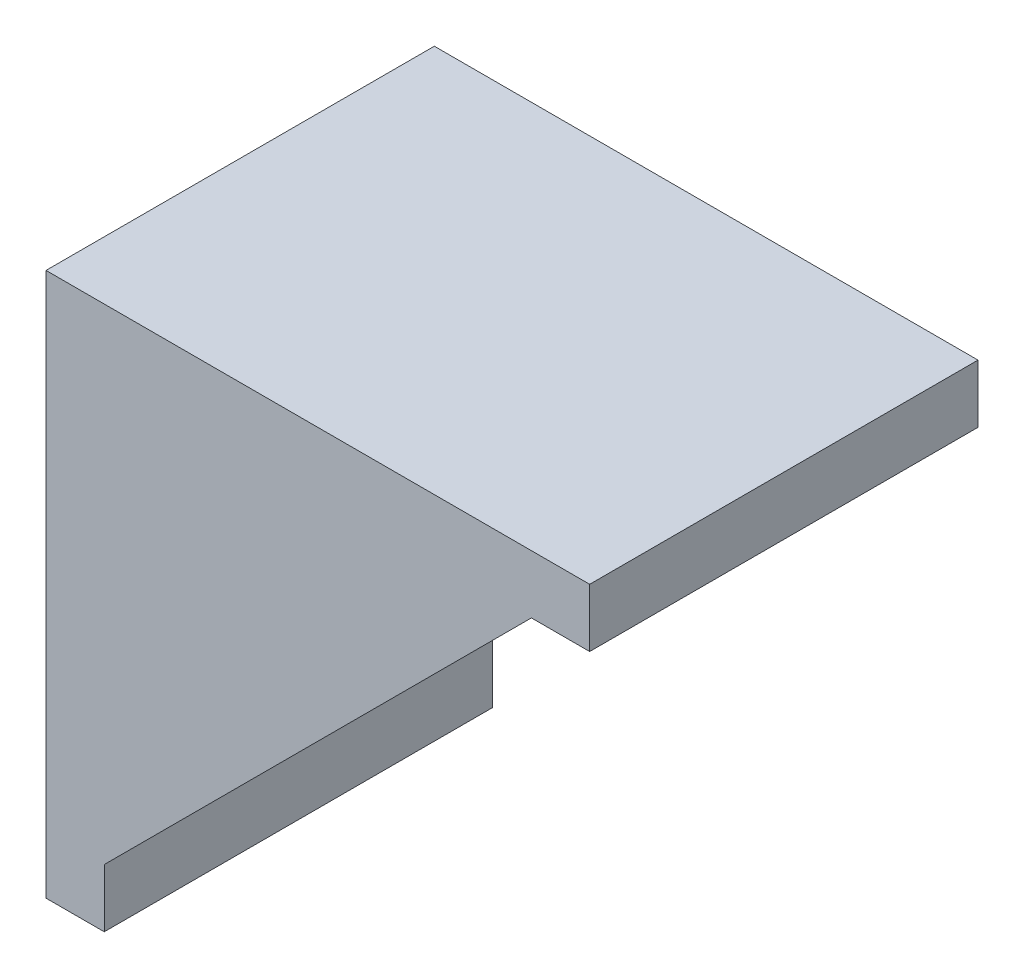
ISO-10303-21;
HEADER;
FILE_DESCRIPTION(('STEP AP214'),'2;1');
FILE_NAME('part.step','',(''),(''),'','','');
FILE_SCHEMA(('AUTOMOTIVE_DESIGN { 1 0 10303 214 1 1 1 1 }'));
ENDSEC;
DATA;
#1=APPLICATION_CONTEXT('core data for automotive mechanical design processes');
#2=APPLICATION_PROTOCOL_DEFINITION('international standard','automotive_design',2000,#1);
#3=PRODUCT_CONTEXT('',#1,'mechanical');
#4=PRODUCT('Part','Part','',(#3));
#5=PRODUCT_RELATED_PRODUCT_CATEGORY('part','',(#4));
#6=PRODUCT_DEFINITION_FORMATION('','',#4);
#7=PRODUCT_DEFINITION_CONTEXT('part definition',#1,'design');
#8=PRODUCT_DEFINITION('design','',#6,#7);
#9=PRODUCT_DEFINITION_SHAPE('','',#8);
#10=(LENGTH_UNIT() NAMED_UNIT(*) SI_UNIT(.MILLI.,.METRE.));
#11=(NAMED_UNIT(*) PLANE_ANGLE_UNIT() SI_UNIT($,.RADIAN.));
#12=(NAMED_UNIT(*) SI_UNIT($,.STERADIAN.) SOLID_ANGLE_UNIT());
#13=UNCERTAINTY_MEASURE_WITH_UNIT(LENGTH_MEASURE(1.E-05),#10,'distance_accuracy_value','');
#14=(GEOMETRIC_REPRESENTATION_CONTEXT(3) GLOBAL_UNCERTAINTY_ASSIGNED_CONTEXT((#13)) GLOBAL_UNIT_ASSIGNED_CONTEXT((#10,
#11,#12)) REPRESENTATION_CONTEXT('',''));
#15=CARTESIAN_POINT('',(0.,0.,0.));
#16=DIRECTION('',(0.,0.,1.));
#17=DIRECTION('',(1.,0.,0.));
#18=AXIS2_PLACEMENT_3D('',#15,#16,#17);
#19=CARTESIAN_POINT('',(-14.,14.,20.));
#20=DIRECTION('',(1.,0.,0.));
#21=DIRECTION('',(0.,1.,0.));
#22=AXIS2_PLACEMENT_3D('',#19,#20,#21);
#23=PLANE('',#22);
#24=DIRECTION('',(0.,-1.,0.));
#25=VECTOR('',#24,1.);
#26=CARTESIAN_POINT('',(-14.,14.,0.));
#27=LINE('',#26,#25);
#28=CARTESIAN_POINT('',(-14.,14.,0.));
#29=VERTEX_POINT('',#28);
#30=CARTESIAN_POINT('',(-14.,-14.,0.));
#31=VERTEX_POINT('',#30);
#32=EDGE_CURVE('E123',#29,#31,#27,.T.);
#33=ORIENTED_EDGE('',*,*,#32,.T.);
#34=DIRECTION('',(0.,0.,-1.));
#35=VECTOR('',#34,1.);
#36=CARTESIAN_POINT('',(-14.,-14.,20.));
#37=LINE('',#36,#35);
#38=CARTESIAN_POINT('',(-14.,-14.,20.));
#39=VERTEX_POINT('',#38);
#40=EDGE_CURVE('E11',#39,#31,#37,.T.);
#41=ORIENTED_EDGE('',*,*,#40,.F.);
#42=DIRECTION('',(0.,-1.,0.));
#43=VECTOR('',#42,1.);
#44=CARTESIAN_POINT('',(-14.,14.,20.));
#45=LINE('',#44,#43);
#46=CARTESIAN_POINT('',(-14.,14.,20.));
#47=VERTEX_POINT('',#46);
#48=EDGE_CURVE('E135',#47,#39,#45,.T.);
#49=ORIENTED_EDGE('',*,*,#48,.F.);
#50=DIRECTION('',(0.,0.,-1.));
#51=VECTOR('',#50,1.);
#52=CARTESIAN_POINT('',(-14.,14.,20.));
#53=LINE('',#52,#51);
#54=EDGE_CURVE('E119',#47,#29,#53,.T.);
#55=ORIENTED_EDGE('',*,*,#54,.T.);
#56=EDGE_LOOP('',(#33,#41,#49,#55));
#57=FACE_BOUND('',#56,.T.);
#58=ADVANCED_FACE('F33',(#57),#23,.F.);
#59=CARTESIAN_POINT('',(-14.,-14.,20.));
#60=DIRECTION('',(0.,1.,0.));
#61=DIRECTION('',(0.,0.,1.));
#62=AXIS2_PLACEMENT_3D('',#59,#60,#61);
#63=PLANE('',#62);
#64=DIRECTION('',(1.,0.,0.));
#65=VECTOR('',#64,1.);
#66=CARTESIAN_POINT('',(-14.,-14.,0.));
#67=LINE('',#66,#65);
#68=CARTESIAN_POINT('',(-11.,-14.,0.));
#69=VERTEX_POINT('',#68);
#70=EDGE_CURVE('E126',#31,#69,#67,.T.);
#71=ORIENTED_EDGE('',*,*,#70,.T.);
#72=DIRECTION('',(0.,0.,-1.));
#73=VECTOR('',#72,1.);
#74=CARTESIAN_POINT('',(-11.,-14.,20.));
#75=LINE('',#74,#73);
#76=CARTESIAN_POINT('',(-11.,-14.,20.));
#77=VERTEX_POINT('',#76);
#78=EDGE_CURVE('E41',#77,#69,#75,.T.);
#79=ORIENTED_EDGE('',*,*,#78,.F.);
#80=DIRECTION('',(1.,0.,0.));
#81=VECTOR('',#80,1.);
#82=CARTESIAN_POINT('',(-14.,-14.,20.));
#83=LINE('',#82,#81);
#84=EDGE_CURVE('E89',#39,#77,#83,.T.);
#85=ORIENTED_EDGE('',*,*,#84,.F.);
#86=ORIENTED_EDGE('',*,*,#40,.T.);
#87=EDGE_LOOP('',(#71,#79,#85,#86));
#88=FACE_BOUND('',#87,.T.);
#89=ADVANCED_FACE('F160',(#88),#63,.F.);
#90=CARTESIAN_POINT('',(-11.,-14.,20.));
#91=DIRECTION('',(-1.,0.,0.));
#92=DIRECTION('',(0.,0.,1.));
#93=AXIS2_PLACEMENT_3D('',#90,#91,#92);
#94=PLANE('',#93);
#95=DIRECTION('',(0.,1.,0.));
#96=VECTOR('',#95,1.);
#97=CARTESIAN_POINT('',(-11.,-14.,0.));
#98=LINE('',#97,#96);
#99=CARTESIAN_POINT('',(-11.,-11.,0.));
#100=VERTEX_POINT('',#99);
#101=EDGE_CURVE('E128',#69,#100,#98,.T.);
#102=ORIENTED_EDGE('',*,*,#101,.T.);
#103=DIRECTION('',(0.,0.,-1.));
#104=VECTOR('',#103,1.);
#105=CARTESIAN_POINT('',(-11.,-11.,20.));
#106=LINE('',#105,#104);
#107=CARTESIAN_POINT('',(-11.,-11.,20.));
#108=VERTEX_POINT('',#107);
#109=EDGE_CURVE('E139',#108,#100,#106,.T.);
#110=ORIENTED_EDGE('',*,*,#109,.F.);
#111=DIRECTION('',(0.,1.,0.));
#112=VECTOR('',#111,1.);
#113=CARTESIAN_POINT('',(-11.,-14.,20.));
#114=LINE('',#113,#112);
#115=EDGE_CURVE('E147',#77,#108,#114,.T.);
#116=ORIENTED_EDGE('',*,*,#115,.F.);
#117=ORIENTED_EDGE('',*,*,#78,.T.);
#118=EDGE_LOOP('',(#102,#110,#116,#117));
#119=FACE_BOUND('',#118,.T.);
#120=ADVANCED_FACE('F145',(#119),#94,.F.);
#121=CARTESIAN_POINT('',(-11.,-11.,20.));
#122=DIRECTION('',(-0.707106781186548,0.707106781186547,0.));
#123=DIRECTION('',(-0.707106781186547,-0.707106781186548,0.));
#124=AXIS2_PLACEMENT_3D('',#121,#122,#123);
#125=PLANE('',#124);
#126=DIRECTION('',(0.707106781186547,0.707106781186548,0.));
#127=VECTOR('',#126,1.);
#128=CARTESIAN_POINT('',(-11.,-11.,0.));
#129=LINE('',#128,#127);
#130=CARTESIAN_POINT('',(11.,11.,0.));
#131=VERTEX_POINT('',#130);
#132=EDGE_CURVE('E130',#100,#131,#129,.T.);
#133=ORIENTED_EDGE('',*,*,#132,.T.);
#134=DIRECTION('',(0.,0.,-1.));
#135=VECTOR('',#134,1.);
#136=CARTESIAN_POINT('',(11.,11.,20.));
#137=LINE('',#136,#135);
#138=CARTESIAN_POINT('',(11.,11.,20.));
#139=VERTEX_POINT('',#138);
#140=EDGE_CURVE('E114',#139,#131,#137,.T.);
#141=ORIENTED_EDGE('',*,*,#140,.F.);
#142=DIRECTION('',(0.707106781186547,0.707106781186548,0.));
#143=VECTOR('',#142,1.);
#144=CARTESIAN_POINT('',(-11.,-11.,20.));
#145=LINE('',#144,#143);
#146=EDGE_CURVE('E105',#108,#139,#145,.T.);
#147=ORIENTED_EDGE('',*,*,#146,.F.);
#148=ORIENTED_EDGE('',*,*,#109,.T.);
#149=EDGE_LOOP('',(#133,#141,#147,#148));
#150=FACE_BOUND('',#149,.T.);
#151=ADVANCED_FACE('F153',(#150),#125,.F.);
#152=CARTESIAN_POINT('',(14.,11.,20.));
#153=DIRECTION('',(0.,1.,0.));
#154=DIRECTION('',(0.,0.,1.));
#155=AXIS2_PLACEMENT_3D('',#152,#153,#154);
#156=PLANE('',#155);
#157=DIRECTION('',(1.,0.,0.));
#158=VECTOR('',#157,1.);
#159=CARTESIAN_POINT('',(14.,11.,0.));
#160=LINE('',#159,#158);
#161=CARTESIAN_POINT('',(14.,11.,0.));
#162=VERTEX_POINT('',#161);
#163=EDGE_CURVE('E113',#131,#162,#160,.T.);
#164=ORIENTED_EDGE('',*,*,#163,.T.);
#165=DIRECTION('',(0.,0.,-1.));
#166=VECTOR('',#165,1.);
#167=CARTESIAN_POINT('',(14.,11.,20.));
#168=LINE('',#167,#166);
#169=CARTESIAN_POINT('',(14.,11.,20.));
#170=VERTEX_POINT('',#169);
#171=EDGE_CURVE('E110',#170,#162,#168,.T.);
#172=ORIENTED_EDGE('',*,*,#171,.F.);
#173=DIRECTION('',(1.,0.,0.));
#174=VECTOR('',#173,1.);
#175=CARTESIAN_POINT('',(14.,11.,20.));
#176=LINE('',#175,#174);
#177=EDGE_CURVE('E99',#139,#170,#176,.T.);
#178=ORIENTED_EDGE('',*,*,#177,.F.);
#179=ORIENTED_EDGE('',*,*,#140,.T.);
#180=EDGE_LOOP('',(#164,#172,#178,#179));
#181=FACE_BOUND('',#180,.T.);
#182=ADVANCED_FACE('F111',(#181),#156,.F.);
#183=CARTESIAN_POINT('',(14.,14.,20.));
#184=DIRECTION('',(-1.,0.,0.));
#185=DIRECTION('',(0.,-1.,0.));
#186=AXIS2_PLACEMENT_3D('',#183,#184,#185);
#187=PLANE('',#186);
#188=DIRECTION('',(0.,1.,0.));
#189=VECTOR('',#188,1.);
#190=CARTESIAN_POINT('',(14.,14.,0.));
#191=LINE('',#190,#189);
#192=CARTESIAN_POINT('',(14.,14.,0.));
#193=VERTEX_POINT('',#192);
#194=EDGE_CURVE('E75',#162,#193,#191,.T.);
#195=ORIENTED_EDGE('',*,*,#194,.T.);
#196=DIRECTION('',(0.,0.,-1.));
#197=VECTOR('',#196,1.);
#198=CARTESIAN_POINT('',(14.,14.,20.));
#199=LINE('',#198,#197);
#200=CARTESIAN_POINT('',(14.,14.,20.));
#201=VERTEX_POINT('',#200);
#202=EDGE_CURVE('E115',#201,#193,#199,.T.);
#203=ORIENTED_EDGE('',*,*,#202,.F.);
#204=DIRECTION('',(0.,1.,0.));
#205=VECTOR('',#204,1.);
#206=CARTESIAN_POINT('',(14.,14.,20.));
#207=LINE('',#206,#205);
#208=EDGE_CURVE('E103',#170,#201,#207,.T.);
#209=ORIENTED_EDGE('',*,*,#208,.F.);
#210=ORIENTED_EDGE('',*,*,#171,.T.);
#211=EDGE_LOOP('',(#195,#203,#209,#210));
#212=FACE_BOUND('',#211,.T.);
#213=ADVANCED_FACE('F117',(#212),#187,.F.);
#214=CARTESIAN_POINT('',(-14.,14.,20.));
#215=DIRECTION('',(0.,-1.,0.));
#216=DIRECTION('',(0.,0.,-1.));
#217=AXIS2_PLACEMENT_3D('',#214,#215,#216);
#218=PLANE('',#217);
#219=DIRECTION('',(-1.,0.,0.));
#220=VECTOR('',#219,1.);
#221=CARTESIAN_POINT('',(-14.,14.,0.));
#222=LINE('',#221,#220);
#223=EDGE_CURVE('E81',#193,#29,#222,.T.);
#224=ORIENTED_EDGE('',*,*,#223,.T.);
#225=ORIENTED_EDGE('',*,*,#54,.F.);
#226=DIRECTION('',(-1.,0.,0.));
#227=VECTOR('',#226,1.);
#228=CARTESIAN_POINT('',(-14.,14.,20.));
#229=LINE('',#228,#227);
#230=EDGE_CURVE('E49',#201,#47,#229,.T.);
#231=ORIENTED_EDGE('',*,*,#230,.F.);
#232=ORIENTED_EDGE('',*,*,#202,.T.);
#233=EDGE_LOOP('',(#224,#225,#231,#232));
#234=FACE_BOUND('',#233,.T.);
#235=ADVANCED_FACE('F174',(#234),#218,.F.);
#236=CARTESIAN_POINT('',(0.,0.,20.));
#237=DIRECTION('',(0.,0.,1.));
#238=DIRECTION('',(1.,0.,0.));
#239=AXIS2_PLACEMENT_3D('',#236,#237,#238);
#240=PLANE('',#239);
#241=ORIENTED_EDGE('',*,*,#48,.T.);
#242=ORIENTED_EDGE('',*,*,#84,.T.);
#243=ORIENTED_EDGE('',*,*,#115,.T.);
#244=ORIENTED_EDGE('',*,*,#146,.T.);
#245=ORIENTED_EDGE('',*,*,#177,.T.);
#246=ORIENTED_EDGE('',*,*,#208,.T.);
#247=ORIENTED_EDGE('',*,*,#230,.T.);
#248=EDGE_LOOP('',(#241,#242,#243,#244,#245,#246,#247));
#249=FACE_BOUND('',#248,.T.);
#250=ADVANCED_FACE('F101',(#249),#240,.T.);
#251=CARTESIAN_POINT('',(0.,0.,0.));
#252=DIRECTION('',(0.,0.,1.));
#253=DIRECTION('',(1.,0.,0.));
#254=AXIS2_PLACEMENT_3D('',#251,#252,#253);
#255=PLANE('',#254);
#256=ORIENTED_EDGE('',*,*,#32,.F.);
#257=ORIENTED_EDGE('',*,*,#223,.F.);
#258=ORIENTED_EDGE('',*,*,#194,.F.);
#259=ORIENTED_EDGE('',*,*,#163,.F.);
#260=ORIENTED_EDGE('',*,*,#132,.F.);
#261=ORIENTED_EDGE('',*,*,#101,.F.);
#262=ORIENTED_EDGE('',*,*,#70,.F.);
#263=EDGE_LOOP('',(#256,#257,#258,#259,#260,#261,#262));
#264=FACE_BOUND('',#263,.T.);
#265=ADVANCED_FACE('F151',(#264),#255,.F.);
#266=CLOSED_SHELL('',(#58,#89,#120,#151,#182,#213,#235,#250,#265));
#267=MANIFOLD_SOLID_BREP('B2',#266);
#268=ADVANCED_BREP_SHAPE_REPRESENTATION('',(#18,#267),#14);
#269=SHAPE_DEFINITION_REPRESENTATION(#9,#268);
ENDSEC;
END-ISO-10303-21;
